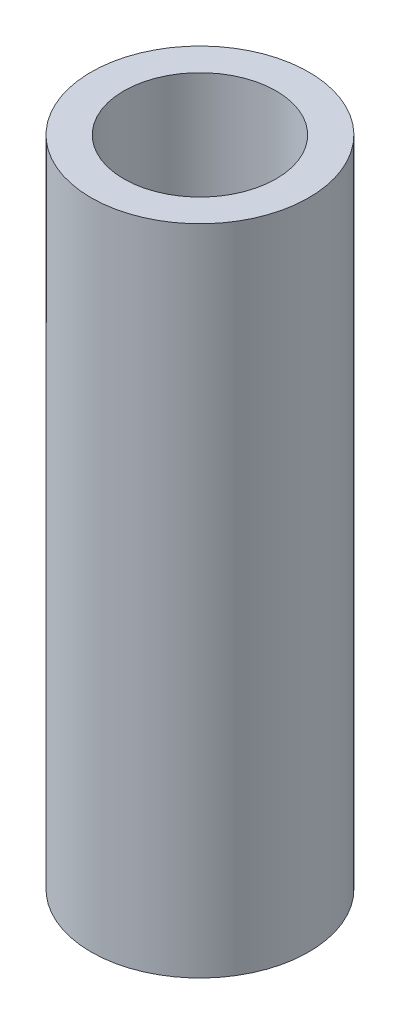
ISO-10303-21;
HEADER;
FILE_DESCRIPTION(('STEP AP214'),'2;1');
FILE_NAME('part.step','',(''),(''),'','','');
FILE_SCHEMA(('AUTOMOTIVE_DESIGN { 1 0 10303 214 1 1 1 1 }'));
ENDSEC;
DATA;
#1=APPLICATION_CONTEXT('core data for automotive mechanical design processes');
#2=APPLICATION_PROTOCOL_DEFINITION('international standard','automotive_design',2000,#1);
#3=PRODUCT_CONTEXT('',#1,'mechanical');
#4=PRODUCT('Part','Part','',(#3));
#5=PRODUCT_RELATED_PRODUCT_CATEGORY('part','',(#4));
#6=PRODUCT_DEFINITION_FORMATION('','',#4);
#7=PRODUCT_DEFINITION_CONTEXT('part definition',#1,'design');
#8=PRODUCT_DEFINITION('design','',#6,#7);
#9=PRODUCT_DEFINITION_SHAPE('','',#8);
#10=(LENGTH_UNIT() NAMED_UNIT(*) SI_UNIT(.MILLI.,.METRE.));
#11=(NAMED_UNIT(*) PLANE_ANGLE_UNIT() SI_UNIT($,.RADIAN.));
#12=(NAMED_UNIT(*) SI_UNIT($,.STERADIAN.) SOLID_ANGLE_UNIT());
#13=UNCERTAINTY_MEASURE_WITH_UNIT(LENGTH_MEASURE(1.E-05),#10,'distance_accuracy_value','');
#14=(GEOMETRIC_REPRESENTATION_CONTEXT(3) GLOBAL_UNCERTAINTY_ASSIGNED_CONTEXT((#13)) GLOBAL_UNIT_ASSIGNED_CONTEXT((#10,
#11,#12)) REPRESENTATION_CONTEXT('',''));
#15=CARTESIAN_POINT('',(0.,0.,0.));
#16=DIRECTION('',(0.,0.,1.));
#17=DIRECTION('',(1.,0.,0.));
#18=AXIS2_PLACEMENT_3D('',#15,#16,#17);
#19=CARTESIAN_POINT('',(0.,-0.001000000000001,0.));
#20=DIRECTION('',(0.,1.,0.));
#21=DIRECTION('',(0.,0.,1.));
#22=AXIS2_PLACEMENT_3D('',#19,#20,#21);
#23=CYLINDRICAL_SURFACE('',#22,2.);
#24=CARTESIAN_POINT('',(0.,0.,0.));
#25=DIRECTION('',(0.,1.,0.));
#26=DIRECTION('',(0.,0.,1.));
#27=AXIS2_PLACEMENT_3D('',#24,#25,#26);
#28=CIRCLE('',#27,2.);
#29=CARTESIAN_POINT('',(0.,0.,2.));
#30=VERTEX_POINT('',#29);
#31=EDGE_CURVE('E47',#30,#30,#28,.F.);
#32=ORIENTED_EDGE('',*,*,#31,.T.);
#33=EDGE_LOOP('',(#32));
#34=FACE_BOUND('',#33,.T.);
#35=CARTESIAN_POINT('',(0.,5.,0.));
#36=DIRECTION('',(0.,1.,0.));
#37=DIRECTION('',(0.,0.,1.));
#38=AXIS2_PLACEMENT_3D('',#35,#36,#37);
#39=CIRCLE('',#38,2.);
#40=CARTESIAN_POINT('',(0.,5.,2.));
#41=VERTEX_POINT('',#40);
#42=EDGE_CURVE('E38',#41,#41,#39,.F.);
#43=ORIENTED_EDGE('',*,*,#42,.F.);
#44=EDGE_LOOP('',(#43));
#45=FACE_BOUND('',#44,.T.);
#46=ADVANCED_FACE('F34',(#34,#45),#23,.F.);
#47=CARTESIAN_POINT('',(0.,30.,0.));
#48=DIRECTION('',(0.,-1.,0.));
#49=DIRECTION('',(0.,0.,-1.));
#50=AXIS2_PLACEMENT_3D('',#47,#48,#49);
#51=CYLINDRICAL_SURFACE('',#50,5.);
#52=CARTESIAN_POINT('',(0.,30.,0.));
#53=DIRECTION('',(0.,1.,0.));
#54=DIRECTION('',(0.,0.,1.));
#55=AXIS2_PLACEMENT_3D('',#52,#53,#54);
#56=CIRCLE('',#55,5.);
#57=CARTESIAN_POINT('',(0.,30.,5.));
#58=VERTEX_POINT('',#57);
#59=EDGE_CURVE('E10',#58,#58,#56,.T.);
#60=ORIENTED_EDGE('',*,*,#59,.F.);
#61=EDGE_LOOP('',(#60));
#62=FACE_BOUND('',#61,.T.);
#63=CARTESIAN_POINT('',(0.,0.,0.));
#64=DIRECTION('',(0.,1.,0.));
#65=DIRECTION('',(0.,0.,1.));
#66=AXIS2_PLACEMENT_3D('',#63,#64,#65);
#67=CIRCLE('',#66,5.);
#68=CARTESIAN_POINT('',(0.,0.,5.));
#69=VERTEX_POINT('',#68);
#70=EDGE_CURVE('E42',#69,#69,#67,.T.);
#71=ORIENTED_EDGE('',*,*,#70,.T.);
#72=EDGE_LOOP('',(#71));
#73=FACE_BOUND('',#72,.T.);
#74=ADVANCED_FACE('F36',(#62,#73),#51,.T.);
#75=CARTESIAN_POINT('',(0.,30.,0.));
#76=DIRECTION('',(0.,1.,0.));
#77=DIRECTION('',(0.,0.,1.));
#78=AXIS2_PLACEMENT_3D('',#75,#76,#77);
#79=PLANE('',#78);
#80=CARTESIAN_POINT('',(0.,30.,0.));
#81=DIRECTION('',(0.,1.,0.));
#82=DIRECTION('',(0.,0.,1.));
#83=AXIS2_PLACEMENT_3D('',#80,#81,#82);
#84=CIRCLE('',#83,3.5);
#85=CARTESIAN_POINT('',(0.,30.,3.5));
#86=VERTEX_POINT('',#85);
#87=EDGE_CURVE('E51',#86,#86,#84,.T.);
#88=ORIENTED_EDGE('',*,*,#87,.F.);
#89=EDGE_LOOP('',(#88));
#90=FACE_BOUND('',#89,.T.);
#91=ORIENTED_EDGE('',*,*,#59,.T.);
#92=EDGE_LOOP('',(#91));
#93=FACE_BOUND('',#92,.T.);
#94=ADVANCED_FACE('F69',(#90,#93),#79,.T.);
#95=CARTESIAN_POINT('',(0.,0.,0.));
#96=DIRECTION('',(0.,1.,0.));
#97=DIRECTION('',(0.,0.,1.));
#98=AXIS2_PLACEMENT_3D('',#95,#96,#97);
#99=PLANE('',#98);
#100=ORIENTED_EDGE('',*,*,#31,.F.);
#101=EDGE_LOOP('',(#100));
#102=FACE_BOUND('',#101,.T.);
#103=ORIENTED_EDGE('',*,*,#70,.F.);
#104=EDGE_LOOP('',(#103));
#105=FACE_BOUND('',#104,.T.);
#106=ADVANCED_FACE('F76',(#102,#105),#99,.F.);
#107=CARTESIAN_POINT('',(0.,5.,0.));
#108=DIRECTION('',(0.,1.,0.));
#109=DIRECTION('',(0.,0.,1.));
#110=AXIS2_PLACEMENT_3D('',#107,#108,#109);
#111=PLANE('',#110);
#112=CARTESIAN_POINT('',(0.,5.,0.));
#113=DIRECTION('',(0.,1.,0.));
#114=DIRECTION('',(0.,0.,1.));
#115=AXIS2_PLACEMENT_3D('',#112,#113,#114);
#116=CIRCLE('',#115,3.5);
#117=CARTESIAN_POINT('',(0.,5.,3.5));
#118=VERTEX_POINT('',#117);
#119=EDGE_CURVE('E54',#118,#118,#116,.T.);
#120=ORIENTED_EDGE('',*,*,#119,.T.);
#121=EDGE_LOOP('',(#120));
#122=FACE_BOUND('',#121,.T.);
#123=ORIENTED_EDGE('',*,*,#42,.T.);
#124=EDGE_LOOP('',(#123));
#125=FACE_BOUND('',#124,.T.);
#126=ADVANCED_FACE('F61',(#122,#125),#111,.T.);
#127=CARTESIAN_POINT('',(0.,5.,0.));
#128=DIRECTION('',(0.,1.,0.));
#129=DIRECTION('',(0.,0.,1.));
#130=AXIS2_PLACEMENT_3D('',#127,#128,#129);
#131=CYLINDRICAL_SURFACE('',#130,3.5);
#132=ORIENTED_EDGE('',*,*,#119,.F.);
#133=EDGE_LOOP('',(#132));
#134=FACE_BOUND('',#133,.T.);
#135=ORIENTED_EDGE('',*,*,#87,.T.);
#136=EDGE_LOOP('',(#135));
#137=FACE_BOUND('',#136,.T.);
#138=ADVANCED_FACE('F73',(#134,#137),#131,.F.);
#139=CLOSED_SHELL('',(#46,#74,#94,#106,#126,#138));
#140=MANIFOLD_SOLID_BREP('B2',#139);
#141=ADVANCED_BREP_SHAPE_REPRESENTATION('',(#18,#140),#14);
#142=SHAPE_DEFINITION_REPRESENTATION(#9,#141);
ENDSEC;
END-ISO-10303-21;
